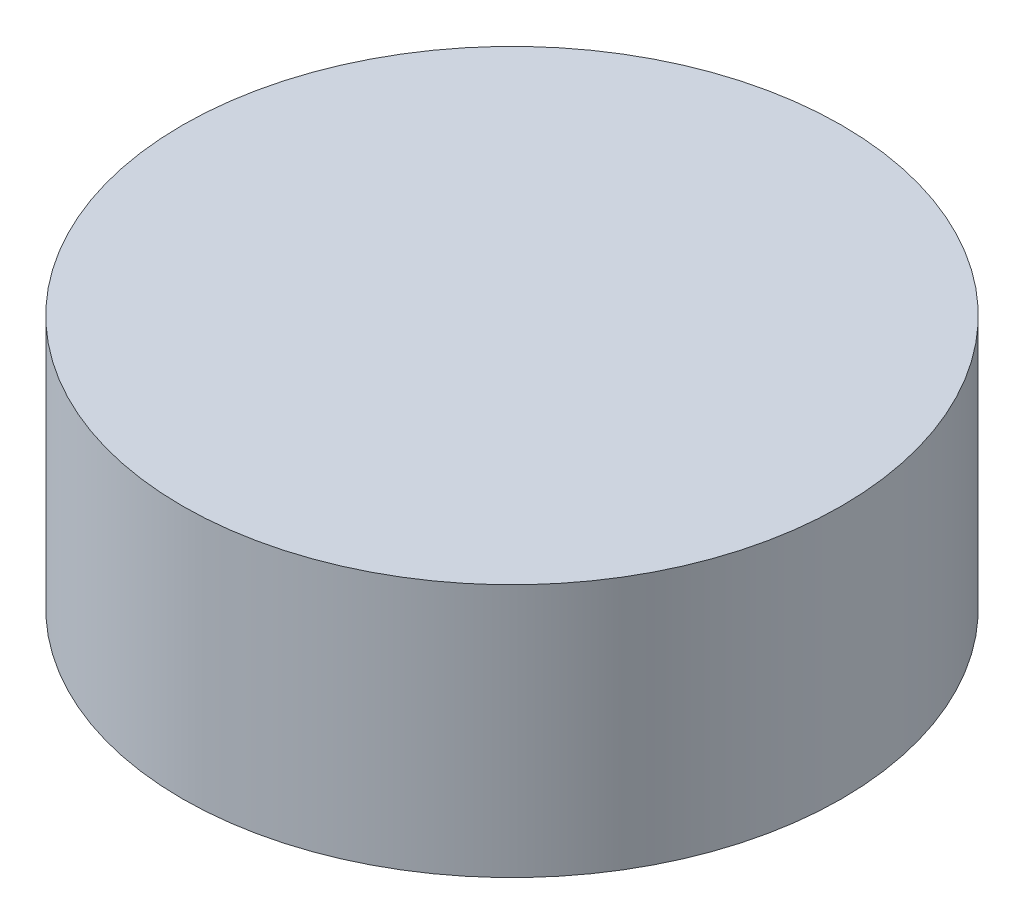
ISO-10303-21;
HEADER;
FILE_DESCRIPTION(('STEP AP214'),'2;1');
FILE_NAME('part.step','',(''),(''),'','','');
FILE_SCHEMA(('AUTOMOTIVE_DESIGN { 1 0 10303 214 1 1 1 1 }'));
ENDSEC;
DATA;
#1=APPLICATION_CONTEXT('core data for automotive mechanical design processes');
#2=APPLICATION_PROTOCOL_DEFINITION('international standard','automotive_design',2000,#1);
#3=PRODUCT_CONTEXT('',#1,'mechanical');
#4=PRODUCT('Part','Part','',(#3));
#5=PRODUCT_RELATED_PRODUCT_CATEGORY('part','',(#4));
#6=PRODUCT_DEFINITION_FORMATION('','',#4);
#7=PRODUCT_DEFINITION_CONTEXT('part definition',#1,'design');
#8=PRODUCT_DEFINITION('design','',#6,#7);
#9=PRODUCT_DEFINITION_SHAPE('','',#8);
#10=(LENGTH_UNIT() NAMED_UNIT(*) SI_UNIT(.MILLI.,.METRE.));
#11=(NAMED_UNIT(*) PLANE_ANGLE_UNIT() SI_UNIT($,.RADIAN.));
#12=(NAMED_UNIT(*) SI_UNIT($,.STERADIAN.) SOLID_ANGLE_UNIT());
#13=UNCERTAINTY_MEASURE_WITH_UNIT(LENGTH_MEASURE(1.E-05),#10,'distance_accuracy_value','');
#14=(GEOMETRIC_REPRESENTATION_CONTEXT(3) GLOBAL_UNCERTAINTY_ASSIGNED_CONTEXT((#13)) GLOBAL_UNIT_ASSIGNED_CONTEXT((#10,
#11,#12)) REPRESENTATION_CONTEXT('',''));
#15=CARTESIAN_POINT('',(0.,0.,0.));
#16=DIRECTION('',(0.,0.,1.));
#17=DIRECTION('',(1.,0.,0.));
#18=AXIS2_PLACEMENT_3D('',#15,#16,#17);
#19=CARTESIAN_POINT('',(0.,25.,0.));
#20=DIRECTION('',(0.,-1.,0.));
#21=DIRECTION('',(0.,0.,-1.));
#22=AXIS2_PLACEMENT_3D('',#19,#20,#21);
#23=CYLINDRICAL_SURFACE('',#22,32.5);
#24=CARTESIAN_POINT('',(0.,25.,0.));
#25=DIRECTION('',(0.,1.,0.));
#26=DIRECTION('',(0.,0.,1.));
#27=AXIS2_PLACEMENT_3D('',#24,#25,#26);
#28=CIRCLE('',#27,32.5);
#29=CARTESIAN_POINT('',(0.,25.,32.5));
#30=VERTEX_POINT('',#29);
#31=EDGE_CURVE('E10',#30,#30,#28,.T.);
#32=ORIENTED_EDGE('',*,*,#31,.F.);
#33=EDGE_LOOP('',(#32));
#34=FACE_BOUND('',#33,.T.);
#35=CARTESIAN_POINT('',(0.,0.,0.));
#36=DIRECTION('',(0.,1.,0.));
#37=DIRECTION('',(0.,0.,1.));
#38=AXIS2_PLACEMENT_3D('',#35,#36,#37);
#39=CIRCLE('',#38,32.5);
#40=CARTESIAN_POINT('',(0.,0.,32.5));
#41=VERTEX_POINT('',#40);
#42=EDGE_CURVE('E35',#41,#41,#39,.T.);
#43=ORIENTED_EDGE('',*,*,#42,.T.);
#44=EDGE_LOOP('',(#43));
#45=FACE_BOUND('',#44,.T.);
#46=ADVANCED_FACE('F32',(#34,#45),#23,.T.);
#47=CARTESIAN_POINT('',(0.,25.,0.));
#48=DIRECTION('',(0.,1.,0.));
#49=DIRECTION('',(0.,0.,1.));
#50=AXIS2_PLACEMENT_3D('',#47,#48,#49);
#51=PLANE('',#50);
#52=ORIENTED_EDGE('',*,*,#31,.T.);
#53=EDGE_LOOP('',(#52));
#54=FACE_BOUND('',#53,.T.);
#55=ADVANCED_FACE('F47',(#54),#51,.T.);
#56=CARTESIAN_POINT('',(0.,0.,0.));
#57=DIRECTION('',(0.,1.,0.));
#58=DIRECTION('',(0.,0.,1.));
#59=AXIS2_PLACEMENT_3D('',#56,#57,#58);
#60=PLANE('',#59);
#61=ORIENTED_EDGE('',*,*,#42,.F.);
#62=EDGE_LOOP('',(#61));
#63=FACE_BOUND('',#62,.T.);
#64=ADVANCED_FACE('F45',(#63),#60,.F.);
#65=CLOSED_SHELL('',(#46,#55,#64));
#66=MANIFOLD_SOLID_BREP('B2',#65);
#67=ADVANCED_BREP_SHAPE_REPRESENTATION('',(#18,#66),#14);
#68=SHAPE_DEFINITION_REPRESENTATION(#9,#67);
ENDSEC;
END-ISO-10303-21;
